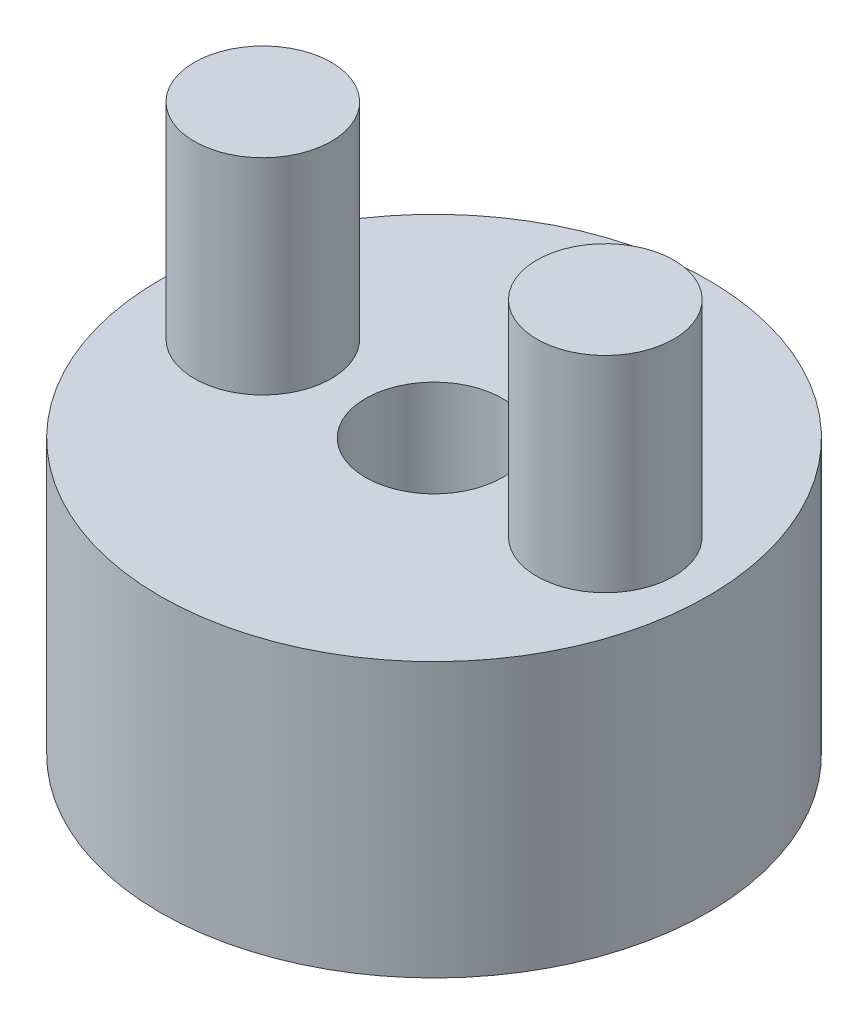
ISO-10303-21;
HEADER;
FILE_DESCRIPTION(('STEP AP214'),'2;1');
FILE_NAME('part.step','',(''),(''),'','','');
FILE_SCHEMA(('AUTOMOTIVE_DESIGN { 1 0 10303 214 1 1 1 1 }'));
ENDSEC;
DATA;
#1=APPLICATION_CONTEXT('core data for automotive mechanical design processes');
#2=APPLICATION_PROTOCOL_DEFINITION('international standard','automotive_design',2000,#1);
#3=PRODUCT_CONTEXT('',#1,'mechanical');
#4=PRODUCT('Part','Part','',(#3));
#5=PRODUCT_RELATED_PRODUCT_CATEGORY('part','',(#4));
#6=PRODUCT_DEFINITION_FORMATION('','',#4);
#7=PRODUCT_DEFINITION_CONTEXT('part definition',#1,'design');
#8=PRODUCT_DEFINITION('design','',#6,#7);
#9=PRODUCT_DEFINITION_SHAPE('','',#8);
#10=(LENGTH_UNIT() NAMED_UNIT(*) SI_UNIT(.MILLI.,.METRE.));
#11=(NAMED_UNIT(*) PLANE_ANGLE_UNIT() SI_UNIT($,.RADIAN.));
#12=(NAMED_UNIT(*) SI_UNIT($,.STERADIAN.) SOLID_ANGLE_UNIT());
#13=UNCERTAINTY_MEASURE_WITH_UNIT(LENGTH_MEASURE(1.E-05),#10,'distance_accuracy_value','');
#14=(GEOMETRIC_REPRESENTATION_CONTEXT(3) GLOBAL_UNCERTAINTY_ASSIGNED_CONTEXT((#13)) GLOBAL_UNIT_ASSIGNED_CONTEXT((#10,
#11,#12)) REPRESENTATION_CONTEXT('',''));
#15=CARTESIAN_POINT('',(0.,0.,0.));
#16=DIRECTION('',(0.,0.,1.));
#17=DIRECTION('',(1.,0.,0.));
#18=AXIS2_PLACEMENT_3D('',#15,#16,#17);
#19=CARTESIAN_POINT('',(0.,6.35,0.));
#20=DIRECTION('',(0.,-1.,0.));
#21=DIRECTION('',(0.,0.,-1.));
#22=AXIS2_PLACEMENT_3D('',#19,#20,#21);
#23=CYLINDRICAL_SURFACE('',#22,6.35);
#24=CARTESIAN_POINT('',(0.,6.35,0.));
#25=DIRECTION('',(0.,1.,0.));
#26=DIRECTION('',(0.,0.,1.));
#27=AXIS2_PLACEMENT_3D('',#24,#25,#26);
#28=CIRCLE('',#27,6.35);
#29=CARTESIAN_POINT('',(0.,6.35,6.35));
#30=VERTEX_POINT('',#29);
#31=EDGE_CURVE('E10',#30,#30,#28,.T.);
#32=ORIENTED_EDGE('',*,*,#31,.F.);
#33=EDGE_LOOP('',(#32));
#34=FACE_BOUND('',#33,.T.);
#35=CARTESIAN_POINT('',(0.,0.,0.));
#36=DIRECTION('',(0.,1.,0.));
#37=DIRECTION('',(0.,0.,1.));
#38=AXIS2_PLACEMENT_3D('',#35,#36,#37);
#39=CIRCLE('',#38,6.35);
#40=CARTESIAN_POINT('',(0.,0.,6.35));
#41=VERTEX_POINT('',#40);
#42=EDGE_CURVE('E36',#41,#41,#39,.T.);
#43=ORIENTED_EDGE('',*,*,#42,.T.);
#44=EDGE_LOOP('',(#43));
#45=FACE_BOUND('',#44,.T.);
#46=ADVANCED_FACE('F33',(#34,#45),#23,.T.);
#47=CARTESIAN_POINT('',(0.,6.35,0.));
#48=DIRECTION('',(0.,1.,0.));
#49=DIRECTION('',(0.,0.,1.));
#50=AXIS2_PLACEMENT_3D('',#47,#48,#49);
#51=PLANE('',#50);
#52=CARTESIAN_POINT('',(-3.96875,6.35,0.));
#53=DIRECTION('',(0.,1.,0.));
#54=DIRECTION('',(0.,0.,1.));
#55=AXIS2_PLACEMENT_3D('',#52,#53,#54);
#56=CIRCLE('',#55,1.5875);
#57=CARTESIAN_POINT('',(-3.96875,6.35,-1.5875));
#58=VERTEX_POINT('',#57);
#59=EDGE_CURVE('E57',#58,#58,#56,.T.);
#60=ORIENTED_EDGE('',*,*,#59,.F.);
#61=EDGE_LOOP('',(#60));
#62=FACE_BOUND('',#61,.T.);
#63=CARTESIAN_POINT('',(3.96875,6.35,0.));
#64=DIRECTION('',(0.,1.,0.));
#65=DIRECTION('',(0.,0.,1.));
#66=AXIS2_PLACEMENT_3D('',#63,#64,#65);
#67=CIRCLE('',#66,1.5875);
#68=CARTESIAN_POINT('',(3.96875,6.35,-1.5875));
#69=VERTEX_POINT('',#68);
#70=EDGE_CURVE('E51',#69,#69,#67,.T.);
#71=ORIENTED_EDGE('',*,*,#70,.F.);
#72=EDGE_LOOP('',(#71));
#73=FACE_BOUND('',#72,.T.);
#74=CARTESIAN_POINT('',(0.,6.35,0.));
#75=DIRECTION('',(0.,1.,0.));
#76=DIRECTION('',(0.,0.,1.));
#77=AXIS2_PLACEMENT_3D('',#74,#75,#76);
#78=CIRCLE('',#77,1.5875);
#79=CARTESIAN_POINT('',(0.,6.35,1.5875));
#80=VERTEX_POINT('',#79);
#81=EDGE_CURVE('E47',#80,#80,#78,.T.);
#82=ORIENTED_EDGE('',*,*,#81,.F.);
#83=EDGE_LOOP('',(#82));
#84=FACE_BOUND('',#83,.T.);
#85=ORIENTED_EDGE('',*,*,#31,.T.);
#86=EDGE_LOOP('',(#85));
#87=FACE_BOUND('',#86,.T.);
#88=ADVANCED_FACE('F72',(#62,#73,#84,#87),#51,.T.);
#89=CARTESIAN_POINT('',(0.,0.,0.));
#90=DIRECTION('',(0.,1.,0.));
#91=DIRECTION('',(0.,0.,1.));
#92=AXIS2_PLACEMENT_3D('',#89,#90,#91);
#93=PLANE('',#92);
#94=CARTESIAN_POINT('',(0.,0.,0.));
#95=DIRECTION('',(0.,1.,0.));
#96=DIRECTION('',(0.,0.,1.));
#97=AXIS2_PLACEMENT_3D('',#94,#95,#96);
#98=CIRCLE('',#97,1.5875);
#99=CARTESIAN_POINT('',(0.,0.,1.5875));
#100=VERTEX_POINT('',#99);
#101=EDGE_CURVE('E43',#100,#100,#98,.T.);
#102=ORIENTED_EDGE('',*,*,#101,.T.);
#103=EDGE_LOOP('',(#102));
#104=FACE_BOUND('',#103,.T.);
#105=ORIENTED_EDGE('',*,*,#42,.F.);
#106=EDGE_LOOP('',(#105));
#107=FACE_BOUND('',#106,.T.);
#108=ADVANCED_FACE('F75',(#104,#107),#93,.F.);
#109=CARTESIAN_POINT('',(0.,6.35,0.));
#110=DIRECTION('',(0.,1.,0.));
#111=DIRECTION('',(0.,0.,1.));
#112=AXIS2_PLACEMENT_3D('',#109,#110,#111);
#113=CYLINDRICAL_SURFACE('',#112,1.5875);
#114=ORIENTED_EDGE('',*,*,#101,.F.);
#115=EDGE_LOOP('',(#114));
#116=FACE_BOUND('',#115,.T.);
#117=ORIENTED_EDGE('',*,*,#81,.T.);
#118=EDGE_LOOP('',(#117));
#119=FACE_BOUND('',#118,.T.);
#120=ADVANCED_FACE('F81',(#116,#119),#113,.F.);
#121=CARTESIAN_POINT('',(3.96875,11.1125,0.));
#122=DIRECTION('',(0.,-1.,0.));
#123=DIRECTION('',(0.,0.,-1.));
#124=AXIS2_PLACEMENT_3D('',#121,#122,#123);
#125=CYLINDRICAL_SURFACE('',#124,1.5875);
#126=CARTESIAN_POINT('',(3.96875,11.1125,0.));
#127=DIRECTION('',(0.,1.,0.));
#128=DIRECTION('',(0.,0.,1.));
#129=AXIS2_PLACEMENT_3D('',#126,#127,#128);
#130=CIRCLE('',#129,1.5875);
#131=CARTESIAN_POINT('',(3.96875,11.1125,-1.5875));
#132=VERTEX_POINT('',#131);
#133=EDGE_CURVE('E50',#132,#132,#130,.T.);
#134=CARTESIAN_POINT('',(3.96875,11.1125,-1.5875));
#135=CARTESIAN_POINT('',(3.96875,11.062890625,-1.5875));
#136=CARTESIAN_POINT('',(3.96875,11.01328125,-1.5875));
#137=CARTESIAN_POINT('',(3.96875,10.9140625,-1.5875));
#138=CARTESIAN_POINT('',(3.96875,10.864453125,-1.5875));
#139=CARTESIAN_POINT('',(3.96875,10.765234375,-1.5875));
#140=CARTESIAN_POINT('',(3.96875,10.715625,-1.5875));
#141=CARTESIAN_POINT('',(3.96875,10.61640625,-1.5875));
#142=CARTESIAN_POINT('',(3.96875,10.566796875,-1.5875));
#143=CARTESIAN_POINT('',(3.96875,10.467578125,-1.5875));
#144=CARTESIAN_POINT('',(3.96875,10.41796875,-1.5875));
#145=CARTESIAN_POINT('',(3.96875,10.31875,-1.5875));
#146=CARTESIAN_POINT('',(3.96875,10.269140625,-1.5875));
#147=CARTESIAN_POINT('',(3.96875,10.169921875,-1.5875));
#148=CARTESIAN_POINT('',(3.96875,10.1203125,-1.5875));
#149=CARTESIAN_POINT('',(3.96875,10.02109375,-1.5875));
#150=CARTESIAN_POINT('',(3.96875,9.971484375,-1.5875));
#151=CARTESIAN_POINT('',(3.96875,9.872265625,-1.5875));
#152=CARTESIAN_POINT('',(3.96875,9.82265625,-1.5875));
#153=CARTESIAN_POINT('',(3.96875,9.7234375,-1.5875));
#154=CARTESIAN_POINT('',(3.96875,9.673828125,-1.5875));
#155=CARTESIAN_POINT('',(3.96875,9.574609375,-1.5875));
#156=CARTESIAN_POINT('',(3.96875,9.525,-1.5875));
#157=CARTESIAN_POINT('',(3.96875,9.42578125,-1.5875));
#158=CARTESIAN_POINT('',(3.96875,9.376171875,-1.5875));
#159=CARTESIAN_POINT('',(3.96875,9.276953125,-1.5875));
#160=CARTESIAN_POINT('',(3.96875,9.22734375,-1.5875));
#161=CARTESIAN_POINT('',(3.96875,9.128125,-1.5875));
#162=CARTESIAN_POINT('',(3.96875,9.078515625,-1.5875));
#163=CARTESIAN_POINT('',(3.96875,8.979296875,-1.5875));
#164=CARTESIAN_POINT('',(3.96875,8.9296875,-1.5875));
#165=CARTESIAN_POINT('',(3.96875,8.83046875,-1.5875));
#166=CARTESIAN_POINT('',(3.96875,8.780859375,-1.5875));
#167=CARTESIAN_POINT('',(3.96875,8.681640625,-1.5875));
#168=CARTESIAN_POINT('',(3.96875,8.63203125,-1.5875));
#169=CARTESIAN_POINT('',(3.96875,8.5328125,-1.5875));
#170=CARTESIAN_POINT('',(3.96875,8.483203125,-1.5875));
#171=CARTESIAN_POINT('',(3.96875,8.383984375,-1.5875));
#172=CARTESIAN_POINT('',(3.96875,8.334375,-1.5875));
#173=CARTESIAN_POINT('',(3.96875,8.23515625,-1.5875));
#174=CARTESIAN_POINT('',(3.96875,8.185546875,-1.5875));
#175=CARTESIAN_POINT('',(3.96875,8.086328125,-1.5875));
#176=CARTESIAN_POINT('',(3.96875,8.03671875,-1.5875));
#177=CARTESIAN_POINT('',(3.96875,7.9375,-1.5875));
#178=CARTESIAN_POINT('',(3.96875,7.887890625,-1.5875));
#179=CARTESIAN_POINT('',(3.96875,7.788671875,-1.5875));
#180=CARTESIAN_POINT('',(3.96875,7.7390625,-1.5875));
#181=CARTESIAN_POINT('',(3.96875,7.63984375,-1.5875));
#182=CARTESIAN_POINT('',(3.96875,7.590234375,-1.5875));
#183=CARTESIAN_POINT('',(3.96875,7.491015625,-1.5875));
#184=CARTESIAN_POINT('',(3.96875,7.44140625,-1.5875));
#185=CARTESIAN_POINT('',(3.96875,7.3421875,-1.5875));
#186=CARTESIAN_POINT('',(3.96875,7.292578125,-1.5875));
#187=CARTESIAN_POINT('',(3.96875,7.193359375,-1.5875));
#188=CARTESIAN_POINT('',(3.96875,7.14375,-1.5875));
#189=CARTESIAN_POINT('',(3.96875,7.04453125,-1.5875));
#190=CARTESIAN_POINT('',(3.96875,6.994921875,-1.5875));
#191=CARTESIAN_POINT('',(3.96875,6.895703125,-1.5875));
#192=CARTESIAN_POINT('',(3.96875,6.84609375,-1.5875));
#193=CARTESIAN_POINT('',(3.96875,6.746875,-1.5875));
#194=CARTESIAN_POINT('',(3.96875,6.697265625,-1.5875));
#195=CARTESIAN_POINT('',(3.96875,6.598046875,-1.5875));
#196=CARTESIAN_POINT('',(3.96875,6.5484375,-1.5875));
#197=CARTESIAN_POINT('',(3.96875,6.44921875,-1.5875));
#198=CARTESIAN_POINT('',(3.96875,6.399609375,-1.5875));
#199=CARTESIAN_POINT('',(3.96875,6.35,-1.5875));
#200=B_SPLINE_CURVE_WITH_KNOTS('',3,(#134,#135,#136,#137,#138,#139,#140,#141,#142,#143,#144,
#145,#146,#147,#148,#149,#150,#151,#152,#153,#154,#155,#156,#157,#158,#159,#160,#161,#162,#163,
#164,#165,#166,#167,#168,#169,#170,#171,#172,#173,#174,#175,#176,#177,#178,#179,#180,#181,#182,
#183,#184,#185,#186,#187,#188,#189,#190,#191,#192,#193,#194,#195,#196,#197,#198,#199),
.UNSPECIFIED.,.F.,.F.,(4,2,2,2,2,2,2,2,2,2,2,2,2,2,2,2,2,2,2,2,2,2,2,2,2,2,2,2,2,2,2,2,4),(0.,
0.148828124999998,0.297656249999998,0.446484374999999,0.595312499999999,0.744140624999999,
0.892968749999999,1.041796875,1.190625,1.339453125,1.48828125,1.637109375,1.7859375,1.934765625,
2.08359375,2.232421875,2.38125,2.530078125,2.67890625,2.827734375,2.9765625,3.125390625,
3.27421875,3.423046875,3.571875,3.720703125,3.86953125,4.018359375,4.1671875,4.316015625,
4.46484375,4.613671875,4.7625),.UNSPECIFIED.);
#201=EDGE_CURVE('BSEAM83',#132,#69,#200,.T.);
#202=ORIENTED_EDGE('',*,*,#133,.F.);
#203=ORIENTED_EDGE('',*,*,#70,.T.);
#204=ORIENTED_EDGE('',*,*,#201,.T.);
#205=ORIENTED_EDGE('',*,*,#201,.F.);
#206=EDGE_LOOP('',(#202,#204,#203,#205));
#207=FACE_BOUND('',#206,.T.);
#208=ADVANCED_FACE('F83',(#207),#125,.T.);
#209=CARTESIAN_POINT('',(3.96875,11.1125,0.));
#210=DIRECTION('',(0.,1.,0.));
#211=DIRECTION('',(0.,0.,1.));
#212=AXIS2_PLACEMENT_3D('',#209,#210,#211);
#213=PLANE('',#212);
#214=ORIENTED_EDGE('',*,*,#133,.T.);
#215=EDGE_LOOP('',(#214));
#216=FACE_BOUND('',#215,.T.);
#217=ADVANCED_FACE('F68',(#216),#213,.T.);
#218=CARTESIAN_POINT('',(-3.96875,11.1125,0.));
#219=DIRECTION('',(0.,-1.,0.));
#220=DIRECTION('',(0.,0.,-1.));
#221=AXIS2_PLACEMENT_3D('',#218,#219,#220);
#222=CYLINDRICAL_SURFACE('',#221,1.5875);
#223=CARTESIAN_POINT('',(-3.96875,11.1125,0.));
#224=DIRECTION('',(0.,1.,0.));
#225=DIRECTION('',(0.,0.,1.));
#226=AXIS2_PLACEMENT_3D('',#223,#224,#225);
#227=CIRCLE('',#226,1.5875);
#228=CARTESIAN_POINT('',(-3.96875,11.1125,-1.5875));
#229=VERTEX_POINT('',#228);
#230=EDGE_CURVE('E54',#229,#229,#227,.T.);
#231=CARTESIAN_POINT('',(-3.96875,11.1125,-1.5875));
#232=CARTESIAN_POINT('',(-3.96875,11.062890625,-1.5875));
#233=CARTESIAN_POINT('',(-3.96875,11.01328125,-1.5875));
#234=CARTESIAN_POINT('',(-3.96875,10.9140625,-1.5875));
#235=CARTESIAN_POINT('',(-3.96875,10.864453125,-1.5875));
#236=CARTESIAN_POINT('',(-3.96875,10.765234375,-1.5875));
#237=CARTESIAN_POINT('',(-3.96875,10.715625,-1.5875));
#238=CARTESIAN_POINT('',(-3.96875,10.61640625,-1.5875));
#239=CARTESIAN_POINT('',(-3.96875,10.566796875,-1.5875));
#240=CARTESIAN_POINT('',(-3.96875,10.467578125,-1.5875));
#241=CARTESIAN_POINT('',(-3.96875,10.41796875,-1.5875));
#242=CARTESIAN_POINT('',(-3.96875,10.31875,-1.5875));
#243=CARTESIAN_POINT('',(-3.96875,10.269140625,-1.5875));
#244=CARTESIAN_POINT('',(-3.96875,10.169921875,-1.5875));
#245=CARTESIAN_POINT('',(-3.96875,10.1203125,-1.5875));
#246=CARTESIAN_POINT('',(-3.96875,10.02109375,-1.5875));
#247=CARTESIAN_POINT('',(-3.96875,9.971484375,-1.5875));
#248=CARTESIAN_POINT('',(-3.96875,9.872265625,-1.5875));
#249=CARTESIAN_POINT('',(-3.96875,9.82265625,-1.5875));
#250=CARTESIAN_POINT('',(-3.96875,9.7234375,-1.5875));
#251=CARTESIAN_POINT('',(-3.96875,9.673828125,-1.5875));
#252=CARTESIAN_POINT('',(-3.96875,9.574609375,-1.5875));
#253=CARTESIAN_POINT('',(-3.96875,9.525,-1.5875));
#254=CARTESIAN_POINT('',(-3.96875,9.42578125,-1.5875));
#255=CARTESIAN_POINT('',(-3.96875,9.376171875,-1.5875));
#256=CARTESIAN_POINT('',(-3.96875,9.276953125,-1.5875));
#257=CARTESIAN_POINT('',(-3.96875,9.22734375,-1.5875));
#258=CARTESIAN_POINT('',(-3.96875,9.128125,-1.5875));
#259=CARTESIAN_POINT('',(-3.96875,9.078515625,-1.5875));
#260=CARTESIAN_POINT('',(-3.96875,8.979296875,-1.5875));
#261=CARTESIAN_POINT('',(-3.96875,8.9296875,-1.5875));
#262=CARTESIAN_POINT('',(-3.96875,8.83046875,-1.5875));
#263=CARTESIAN_POINT('',(-3.96875,8.780859375,-1.5875));
#264=CARTESIAN_POINT('',(-3.96875,8.681640625,-1.5875));
#265=CARTESIAN_POINT('',(-3.96875,8.63203125,-1.5875));
#266=CARTESIAN_POINT('',(-3.96875,8.5328125,-1.5875));
#267=CARTESIAN_POINT('',(-3.96875,8.483203125,-1.5875));
#268=CARTESIAN_POINT('',(-3.96875,8.383984375,-1.5875));
#269=CARTESIAN_POINT('',(-3.96875,8.334375,-1.5875));
#270=CARTESIAN_POINT('',(-3.96875,8.23515625,-1.5875));
#271=CARTESIAN_POINT('',(-3.96875,8.185546875,-1.5875));
#272=CARTESIAN_POINT('',(-3.96875,8.086328125,-1.5875));
#273=CARTESIAN_POINT('',(-3.96875,8.03671875,-1.5875));
#274=CARTESIAN_POINT('',(-3.96875,7.9375,-1.5875));
#275=CARTESIAN_POINT('',(-3.96875,7.887890625,-1.5875));
#276=CARTESIAN_POINT('',(-3.96875,7.788671875,-1.5875));
#277=CARTESIAN_POINT('',(-3.96875,7.7390625,-1.5875));
#278=CARTESIAN_POINT('',(-3.96875,7.63984375,-1.5875));
#279=CARTESIAN_POINT('',(-3.96875,7.590234375,-1.5875));
#280=CARTESIAN_POINT('',(-3.96875,7.491015625,-1.5875));
#281=CARTESIAN_POINT('',(-3.96875,7.44140625,-1.5875));
#282=CARTESIAN_POINT('',(-3.96875,7.3421875,-1.5875));
#283=CARTESIAN_POINT('',(-3.96875,7.292578125,-1.5875));
#284=CARTESIAN_POINT('',(-3.96875,7.193359375,-1.5875));
#285=CARTESIAN_POINT('',(-3.96875,7.14375,-1.5875));
#286=CARTESIAN_POINT('',(-3.96875,7.04453125,-1.5875));
#287=CARTESIAN_POINT('',(-3.96875,6.994921875,-1.5875));
#288=CARTESIAN_POINT('',(-3.96875,6.895703125,-1.5875));
#289=CARTESIAN_POINT('',(-3.96875,6.84609375,-1.5875));
#290=CARTESIAN_POINT('',(-3.96875,6.746875,-1.5875));
#291=CARTESIAN_POINT('',(-3.96875,6.697265625,-1.5875));
#292=CARTESIAN_POINT('',(-3.96875,6.598046875,-1.5875));
#293=CARTESIAN_POINT('',(-3.96875,6.5484375,-1.5875));
#294=CARTESIAN_POINT('',(-3.96875,6.44921875,-1.5875));
#295=CARTESIAN_POINT('',(-3.96875,6.399609375,-1.5875));
#296=CARTESIAN_POINT('',(-3.96875,6.35,-1.5875));
#297=B_SPLINE_CURVE_WITH_KNOTS('',3,(#231,#232,#233,#234,#235,#236,#237,#238,#239,#240,#241,
#242,#243,#244,#245,#246,#247,#248,#249,#250,#251,#252,#253,#254,#255,#256,#257,#258,#259,#260,
#261,#262,#263,#264,#265,#266,#267,#268,#269,#270,#271,#272,#273,#274,#275,#276,#277,#278,#279,
#280,#281,#282,#283,#284,#285,#286,#287,#288,#289,#290,#291,#292,#293,#294,#295,#296),
.UNSPECIFIED.,.F.,.F.,(4,2,2,2,2,2,2,2,2,2,2,2,2,2,2,2,2,2,2,2,2,2,2,2,2,2,2,2,2,2,2,2,4),(0.,
0.148828124999998,0.297656249999998,0.446484374999999,0.595312499999999,0.744140624999999,
0.892968749999999,1.041796875,1.190625,1.339453125,1.48828125,1.637109375,1.7859375,1.934765625,
2.08359375,2.232421875,2.38125,2.530078125,2.67890625,2.827734375,2.9765625,3.125390625,
3.27421875,3.423046875,3.571875,3.720703125,3.86953125,4.018359375,4.1671875,4.316015625,
4.46484375,4.613671875,4.7625),.UNSPECIFIED.);
#298=EDGE_CURVE('BSEAM65',#229,#58,#297,.T.);
#299=ORIENTED_EDGE('',*,*,#230,.F.);
#300=ORIENTED_EDGE('',*,*,#59,.T.);
#301=ORIENTED_EDGE('',*,*,#298,.T.);
#302=ORIENTED_EDGE('',*,*,#298,.F.);
#303=EDGE_LOOP('',(#299,#301,#300,#302));
#304=FACE_BOUND('',#303,.T.);
#305=ADVANCED_FACE('F65',(#304),#222,.T.);
#306=CARTESIAN_POINT('',(-3.96875,11.1125,0.));
#307=DIRECTION('',(0.,1.,0.));
#308=DIRECTION('',(0.,0.,1.));
#309=AXIS2_PLACEMENT_3D('',#306,#307,#308);
#310=PLANE('',#309);
#311=ORIENTED_EDGE('',*,*,#230,.T.);
#312=EDGE_LOOP('',(#311));
#313=FACE_BOUND('',#312,.T.);
#314=ADVANCED_FACE('F63',(#313),#310,.T.);
#315=CLOSED_SHELL('',(#46,#88,#108,#120,#208,#217,#305,#314));
#316=MANIFOLD_SOLID_BREP('B2',#315);
#317=ADVANCED_BREP_SHAPE_REPRESENTATION('',(#18,#316),#14);
#318=SHAPE_DEFINITION_REPRESENTATION(#9,#317);
ENDSEC;
END-ISO-10303-21;
